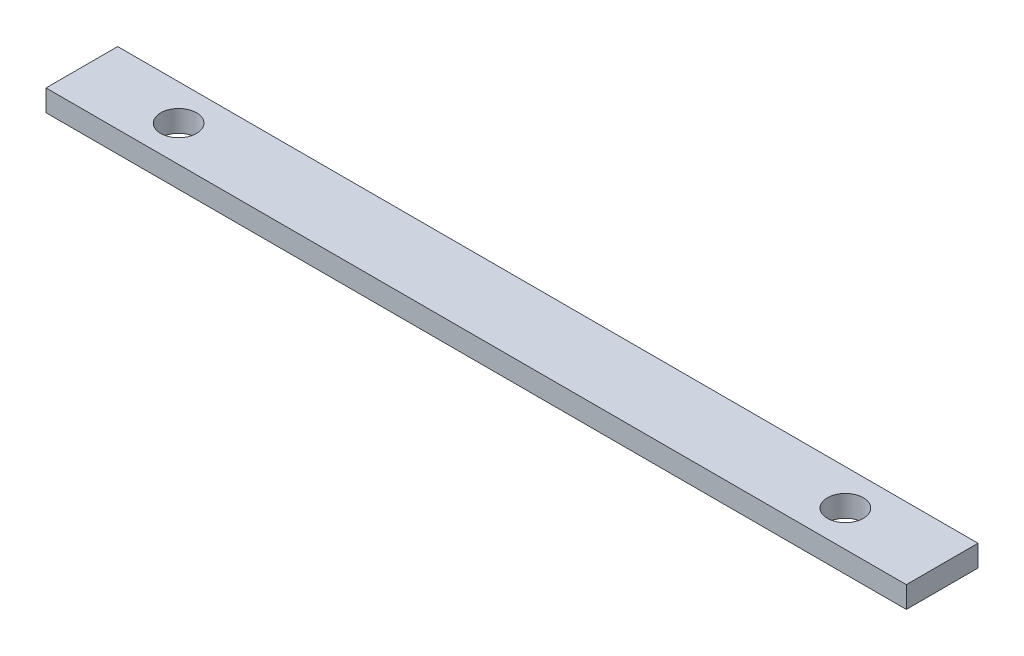
ISO-10303-21;
HEADER;
FILE_DESCRIPTION(('STEP AP214'),'2;1');
FILE_NAME('part.step','',(''),(''),'','','');
FILE_SCHEMA(('AUTOMOTIVE_DESIGN { 1 0 10303 214 1 1 1 1 }'));
ENDSEC;
DATA;
#1=APPLICATION_CONTEXT('core data for automotive mechanical design processes');
#2=APPLICATION_PROTOCOL_DEFINITION('international standard','automotive_design',2000,#1);
#3=PRODUCT_CONTEXT('',#1,'mechanical');
#4=PRODUCT('Part','Part','',(#3));
#5=PRODUCT_RELATED_PRODUCT_CATEGORY('part','',(#4));
#6=PRODUCT_DEFINITION_FORMATION('','',#4);
#7=PRODUCT_DEFINITION_CONTEXT('part definition',#1,'design');
#8=PRODUCT_DEFINITION('design','',#6,#7);
#9=PRODUCT_DEFINITION_SHAPE('','',#8);
#10=(LENGTH_UNIT() NAMED_UNIT(*) SI_UNIT(.MILLI.,.METRE.));
#11=(NAMED_UNIT(*) PLANE_ANGLE_UNIT() SI_UNIT($,.RADIAN.));
#12=(NAMED_UNIT(*) SI_UNIT($,.STERADIAN.) SOLID_ANGLE_UNIT());
#13=UNCERTAINTY_MEASURE_WITH_UNIT(LENGTH_MEASURE(1.E-05),#10,'distance_accuracy_value','');
#14=(GEOMETRIC_REPRESENTATION_CONTEXT(3) GLOBAL_UNCERTAINTY_ASSIGNED_CONTEXT((#13)) GLOBAL_UNIT_ASSIGNED_CONTEXT((#10,
#11,#12)) REPRESENTATION_CONTEXT('',''));
#15=CARTESIAN_POINT('',(0.,0.,0.));
#16=DIRECTION('',(0.,0.,1.));
#17=DIRECTION('',(1.,0.,0.));
#18=AXIS2_PLACEMENT_3D('',#15,#16,#17);
#19=CARTESIAN_POINT('',(60.,3.,5.));
#20=DIRECTION('',(-1.,0.,0.));
#21=DIRECTION('',(0.,0.,1.));
#22=AXIS2_PLACEMENT_3D('',#19,#20,#21);
#23=PLANE('',#22);
#24=DIRECTION('',(0.,0.,-1.));
#25=VECTOR('',#24,1.);
#26=CARTESIAN_POINT('',(60.,0.,5.));
#27=LINE('',#26,#25);
#28=CARTESIAN_POINT('',(60.,0.,5.));
#29=VERTEX_POINT('',#28);
#30=CARTESIAN_POINT('',(60.,0.,-5.));
#31=VERTEX_POINT('',#30);
#32=EDGE_CURVE('E113',#29,#31,#27,.T.);
#33=ORIENTED_EDGE('',*,*,#32,.T.);
#34=DIRECTION('',(0.,-1.,0.));
#35=VECTOR('',#34,1.);
#36=CARTESIAN_POINT('',(60.,3.,-5.));
#37=LINE('',#36,#35);
#38=CARTESIAN_POINT('',(60.,3.,-5.));
#39=VERTEX_POINT('',#38);
#40=EDGE_CURVE('E11',#39,#31,#37,.T.);
#41=ORIENTED_EDGE('',*,*,#40,.F.);
#42=DIRECTION('',(0.,0.,-1.));
#43=VECTOR('',#42,1.);
#44=CARTESIAN_POINT('',(60.,3.,5.));
#45=LINE('',#44,#43);
#46=CARTESIAN_POINT('',(60.,3.,5.));
#47=VERTEX_POINT('',#46);
#48=EDGE_CURVE('E97',#47,#39,#45,.T.);
#49=ORIENTED_EDGE('',*,*,#48,.F.);
#50=DIRECTION('',(0.,-1.,0.));
#51=VECTOR('',#50,1.);
#52=CARTESIAN_POINT('',(60.,3.,5.));
#53=LINE('',#52,#51);
#54=EDGE_CURVE('E109',#47,#29,#53,.T.);
#55=ORIENTED_EDGE('',*,*,#54,.T.);
#56=EDGE_LOOP('',(#33,#41,#49,#55));
#57=FACE_BOUND('',#56,.T.);
#58=ADVANCED_FACE('F45',(#57),#23,.F.);
#59=CARTESIAN_POINT('',(-60.,3.,-5.));
#60=DIRECTION('',(0.,0.,1.));
#61=DIRECTION('',(1.,0.,0.));
#62=AXIS2_PLACEMENT_3D('',#59,#60,#61);
#63=PLANE('',#62);
#64=DIRECTION('',(-1.,0.,0.));
#65=VECTOR('',#64,1.);
#66=CARTESIAN_POINT('',(-60.,0.,-5.));
#67=LINE('',#66,#65);
#68=CARTESIAN_POINT('',(-60.,0.,-5.));
#69=VERTEX_POINT('',#68);
#70=EDGE_CURVE('E102',#31,#69,#67,.T.);
#71=ORIENTED_EDGE('',*,*,#70,.T.);
#72=DIRECTION('',(0.,-1.,0.));
#73=VECTOR('',#72,1.);
#74=CARTESIAN_POINT('',(-60.,3.,-5.));
#75=LINE('',#74,#73);
#76=CARTESIAN_POINT('',(-60.,3.,-5.));
#77=VERTEX_POINT('',#76);
#78=EDGE_CURVE('E54',#77,#69,#75,.T.);
#79=ORIENTED_EDGE('',*,*,#78,.F.);
#80=DIRECTION('',(-1.,0.,0.));
#81=VECTOR('',#80,1.);
#82=CARTESIAN_POINT('',(-60.,3.,-5.));
#83=LINE('',#82,#81);
#84=EDGE_CURVE('E92',#39,#77,#83,.T.);
#85=ORIENTED_EDGE('',*,*,#84,.F.);
#86=ORIENTED_EDGE('',*,*,#40,.T.);
#87=EDGE_LOOP('',(#71,#79,#85,#86));
#88=FACE_BOUND('',#87,.T.);
#89=ADVANCED_FACE('F101',(#88),#63,.F.);
#90=CARTESIAN_POINT('',(-60.,3.,5.));
#91=DIRECTION('',(1.,0.,0.));
#92=DIRECTION('',(0.,0.,-1.));
#93=AXIS2_PLACEMENT_3D('',#90,#91,#92);
#94=PLANE('',#93);
#95=DIRECTION('',(0.,0.,1.));
#96=VECTOR('',#95,1.);
#97=CARTESIAN_POINT('',(-60.,0.,5.));
#98=LINE('',#97,#96);
#99=CARTESIAN_POINT('',(-60.,0.,5.));
#100=VERTEX_POINT('',#99);
#101=EDGE_CURVE('E79',#69,#100,#98,.T.);
#102=ORIENTED_EDGE('',*,*,#101,.T.);
#103=DIRECTION('',(0.,-1.,0.));
#104=VECTOR('',#103,1.);
#105=CARTESIAN_POINT('',(-60.,3.,5.));
#106=LINE('',#105,#104);
#107=CARTESIAN_POINT('',(-60.,3.,5.));
#108=VERTEX_POINT('',#107);
#109=EDGE_CURVE('E104',#108,#100,#106,.T.);
#110=ORIENTED_EDGE('',*,*,#109,.F.);
#111=DIRECTION('',(0.,0.,1.));
#112=VECTOR('',#111,1.);
#113=CARTESIAN_POINT('',(-60.,3.,5.));
#114=LINE('',#113,#112);
#115=EDGE_CURVE('E95',#77,#108,#114,.T.);
#116=ORIENTED_EDGE('',*,*,#115,.F.);
#117=ORIENTED_EDGE('',*,*,#78,.T.);
#118=EDGE_LOOP('',(#102,#110,#116,#117));
#119=FACE_BOUND('',#118,.T.);
#120=ADVANCED_FACE('F105',(#119),#94,.F.);
#121=CARTESIAN_POINT('',(-60.,3.,5.));
#122=DIRECTION('',(0.,0.,-1.));
#123=DIRECTION('',(-1.,0.,0.));
#124=AXIS2_PLACEMENT_3D('',#121,#122,#123);
#125=PLANE('',#124);
#126=DIRECTION('',(1.,0.,0.));
#127=VECTOR('',#126,1.);
#128=CARTESIAN_POINT('',(-60.,0.,5.));
#129=LINE('',#128,#127);
#130=EDGE_CURVE('E85',#100,#29,#129,.T.);
#131=ORIENTED_EDGE('',*,*,#130,.T.);
#132=ORIENTED_EDGE('',*,*,#54,.F.);
#133=DIRECTION('',(1.,0.,0.));
#134=VECTOR('',#133,1.);
#135=CARTESIAN_POINT('',(-60.,3.,5.));
#136=LINE('',#135,#134);
#137=EDGE_CURVE('E62',#108,#47,#136,.T.);
#138=ORIENTED_EDGE('',*,*,#137,.F.);
#139=ORIENTED_EDGE('',*,*,#109,.T.);
#140=EDGE_LOOP('',(#131,#132,#138,#139));
#141=FACE_BOUND('',#140,.T.);
#142=ADVANCED_FACE('F127',(#141),#125,.F.);
#143=CARTESIAN_POINT('',(0.,3.,0.));
#144=DIRECTION('',(0.,-1.,0.));
#145=DIRECTION('',(0.,0.,-1.));
#146=AXIS2_PLACEMENT_3D('',#143,#144,#145);
#147=PLANE('',#146);
#148=CARTESIAN_POINT('',(-46.5,3.,0.));
#149=DIRECTION('',(0.,-1.,0.));
#150=DIRECTION('',(0.,0.,-1.));
#151=AXIS2_PLACEMENT_3D('',#148,#149,#150);
#152=CIRCLE('',#151,2.5);
#153=CARTESIAN_POINT('',(-46.5,3.,-2.5));
#154=VERTEX_POINT('',#153);
#155=EDGE_CURVE('E117',#154,#154,#152,.T.);
#156=ORIENTED_EDGE('',*,*,#155,.T.);
#157=EDGE_LOOP('',(#156));
#158=FACE_BOUND('',#157,.T.);
#159=CARTESIAN_POINT('',(46.5,3.,0.));
#160=DIRECTION('',(0.,-1.,0.));
#161=DIRECTION('',(0.,0.,-1.));
#162=AXIS2_PLACEMENT_3D('',#159,#160,#161);
#163=CIRCLE('',#162,2.50000000000001);
#164=CARTESIAN_POINT('',(46.5,3.,-2.50000000000002));
#165=VERTEX_POINT('',#164);
#166=EDGE_CURVE('E139',#165,#165,#163,.T.);
#167=ORIENTED_EDGE('',*,*,#166,.T.);
#168=EDGE_LOOP('',(#167));
#169=FACE_BOUND('',#168,.T.);
#170=ORIENTED_EDGE('',*,*,#48,.T.);
#171=ORIENTED_EDGE('',*,*,#84,.T.);
#172=ORIENTED_EDGE('',*,*,#115,.T.);
#173=ORIENTED_EDGE('',*,*,#137,.T.);
#174=EDGE_LOOP('',(#170,#171,#172,#173));
#175=FACE_BOUND('',#174,.T.);
#176=ADVANCED_FACE('F93',(#158,#169,#175),#147,.F.);
#177=CARTESIAN_POINT('',(0.,0.,0.));
#178=DIRECTION('',(0.,-1.,0.));
#179=DIRECTION('',(0.,0.,-1.));
#180=AXIS2_PLACEMENT_3D('',#177,#178,#179);
#181=PLANE('',#180);
#182=CARTESIAN_POINT('',(-46.5,0.,0.));
#183=DIRECTION('',(0.,1.,0.));
#184=DIRECTION('',(0.,0.,1.));
#185=AXIS2_PLACEMENT_3D('',#182,#183,#184);
#186=CIRCLE('',#185,2.5);
#187=CARTESIAN_POINT('',(-46.5,0.,-2.5));
#188=VERTEX_POINT('',#187);
#189=EDGE_CURVE('E138',#188,#188,#186,.T.);
#190=ORIENTED_EDGE('',*,*,#189,.T.);
#191=EDGE_LOOP('',(#190));
#192=FACE_BOUND('',#191,.T.);
#193=CARTESIAN_POINT('',(46.5,0.,0.));
#194=DIRECTION('',(0.,1.,0.));
#195=DIRECTION('',(0.,0.,-1.));
#196=AXIS2_PLACEMENT_3D('',#193,#194,#195);
#197=CIRCLE('',#196,2.50000000000001);
#198=CARTESIAN_POINT('',(46.5,0.,-2.50000000000002));
#199=VERTEX_POINT('',#198);
#200=EDGE_CURVE('E134',#199,#199,#197,.T.);
#201=ORIENTED_EDGE('',*,*,#200,.T.);
#202=EDGE_LOOP('',(#201));
#203=FACE_BOUND('',#202,.T.);
#204=ORIENTED_EDGE('',*,*,#32,.F.);
#205=ORIENTED_EDGE('',*,*,#130,.F.);
#206=ORIENTED_EDGE('',*,*,#101,.F.);
#207=ORIENTED_EDGE('',*,*,#70,.F.);
#208=EDGE_LOOP('',(#204,#205,#206,#207));
#209=FACE_BOUND('',#208,.T.);
#210=ADVANCED_FACE('F130',(#192,#203,#209),#181,.T.);
#211=CARTESIAN_POINT('',(46.5,10.0710678118655,0.));
#212=DIRECTION('',(0.,-1.,0.));
#213=DIRECTION('',(0.,0.,-1.));
#214=AXIS2_PLACEMENT_3D('',#211,#212,#213);
#215=CYLINDRICAL_SURFACE('',#214,2.50000000000001);
#216=CARTESIAN_POINT('',(46.5,3.,-2.50000000000002));
#217=CARTESIAN_POINT('',(46.5,2.96875,-2.50000000000002));
#218=CARTESIAN_POINT('',(46.5,2.9375,-2.50000000000002));
#219=CARTESIAN_POINT('',(46.5,2.875,-2.50000000000002));
#220=CARTESIAN_POINT('',(46.5,2.84375,-2.50000000000002));
#221=CARTESIAN_POINT('',(46.5,2.78125,-2.50000000000002));
#222=CARTESIAN_POINT('',(46.5,2.75,-2.50000000000002));
#223=CARTESIAN_POINT('',(46.5,2.6875,-2.50000000000002));
#224=CARTESIAN_POINT('',(46.5,2.65625,-2.50000000000002));
#225=CARTESIAN_POINT('',(46.5,2.59375,-2.50000000000002));
#226=CARTESIAN_POINT('',(46.5,2.5625,-2.50000000000002));
#227=CARTESIAN_POINT('',(46.5,2.5,-2.50000000000002));
#228=CARTESIAN_POINT('',(46.5,2.46875,-2.50000000000002));
#229=CARTESIAN_POINT('',(46.5,2.40625,-2.50000000000002));
#230=CARTESIAN_POINT('',(46.5,2.375,-2.50000000000002));
#231=CARTESIAN_POINT('',(46.5,2.3125,-2.50000000000002));
#232=CARTESIAN_POINT('',(46.5,2.28125,-2.50000000000002));
#233=CARTESIAN_POINT('',(46.5,2.21875,-2.50000000000002));
#234=CARTESIAN_POINT('',(46.5,2.1875,-2.50000000000002));
#235=CARTESIAN_POINT('',(46.5,2.125,-2.50000000000002));
#236=CARTESIAN_POINT('',(46.5,2.09375,-2.50000000000002));
#237=CARTESIAN_POINT('',(46.5,2.03125,-2.50000000000002));
#238=CARTESIAN_POINT('',(46.5,2.,-2.50000000000002));
#239=CARTESIAN_POINT('',(46.5,1.9375,-2.50000000000002));
#240=CARTESIAN_POINT('',(46.5,1.90625,-2.50000000000002));
#241=CARTESIAN_POINT('',(46.5,1.84375,-2.50000000000002));
#242=CARTESIAN_POINT('',(46.5,1.8125,-2.50000000000002));
#243=CARTESIAN_POINT('',(46.5,1.75,-2.50000000000002));
#244=CARTESIAN_POINT('',(46.5,1.71875,-2.50000000000002));
#245=CARTESIAN_POINT('',(46.5,1.65625,-2.50000000000002));
#246=CARTESIAN_POINT('',(46.5,1.625,-2.50000000000002));
#247=CARTESIAN_POINT('',(46.5,1.5625,-2.50000000000002));
#248=CARTESIAN_POINT('',(46.5,1.53125,-2.50000000000002));
#249=CARTESIAN_POINT('',(46.5,1.46875,-2.50000000000002));
#250=CARTESIAN_POINT('',(46.5,1.4375,-2.50000000000002));
#251=CARTESIAN_POINT('',(46.5,1.375,-2.50000000000002));
#252=CARTESIAN_POINT('',(46.5,1.34375,-2.50000000000002));
#253=CARTESIAN_POINT('',(46.5,1.28125,-2.50000000000002));
#254=CARTESIAN_POINT('',(46.5,1.25,-2.50000000000002));
#255=CARTESIAN_POINT('',(46.5,1.1875,-2.50000000000002));
#256=CARTESIAN_POINT('',(46.5,1.15625,-2.50000000000002));
#257=CARTESIAN_POINT('',(46.5,1.09375,-2.50000000000002));
#258=CARTESIAN_POINT('',(46.5,1.0625,-2.50000000000002));
#259=CARTESIAN_POINT('',(46.5,0.999999999999999,-2.50000000000002));
#260=CARTESIAN_POINT('',(46.5,0.968749999999999,-2.50000000000002));
#261=CARTESIAN_POINT('',(46.5,0.906249999999999,-2.50000000000002));
#262=CARTESIAN_POINT('',(46.5,0.874999999999999,-2.50000000000002));
#263=CARTESIAN_POINT('',(46.5,0.812499999999999,-2.50000000000002));
#264=CARTESIAN_POINT('',(46.5,0.781249999999999,-2.50000000000002));
#265=CARTESIAN_POINT('',(46.5,0.718749999999999,-2.50000000000002));
#266=CARTESIAN_POINT('',(46.5,0.687499999999999,-2.50000000000002));
#267=CARTESIAN_POINT('',(46.5,0.624999999999999,-2.50000000000002));
#268=CARTESIAN_POINT('',(46.5,0.593749999999999,-2.50000000000002));
#269=CARTESIAN_POINT('',(46.5,0.531249999999999,-2.50000000000002));
#270=CARTESIAN_POINT('',(46.5,0.499999999999999,-2.50000000000002));
#271=CARTESIAN_POINT('',(46.5,0.437499999999999,-2.50000000000002));
#272=CARTESIAN_POINT('',(46.5,0.406249999999999,-2.50000000000002));
#273=CARTESIAN_POINT('',(46.5,0.343749999999999,-2.50000000000002));
#274=CARTESIAN_POINT('',(46.5,0.312499999999999,-2.50000000000002));
#275=CARTESIAN_POINT('',(46.5,0.249999999999999,-2.50000000000002));
#276=CARTESIAN_POINT('',(46.5,0.218749999999998,-2.50000000000002));
#277=CARTESIAN_POINT('',(46.5,0.156249999999998,-2.50000000000002));
#278=CARTESIAN_POINT('',(46.5,0.124999999999998,-2.50000000000002));
#279=CARTESIAN_POINT('',(46.5,0.0624999999999983,-2.50000000000002));
#280=CARTESIAN_POINT('',(46.5,0.0312499999999983,-2.50000000000002));
#281=CARTESIAN_POINT('',(46.5,0.,-2.50000000000002));
#282=B_SPLINE_CURVE_WITH_KNOTS('',3,(#216,#217,#218,#219,#220,#221,#222,#223,#224,#225,#226,
#227,#228,#229,#230,#231,#232,#233,#234,#235,#236,#237,#238,#239,#240,#241,#242,#243,#244,#245,
#246,#247,#248,#249,#250,#251,#252,#253,#254,#255,#256,#257,#258,#259,#260,#261,#262,#263,#264,
#265,#266,#267,#268,#269,#270,#271,#272,#273,#274,#275,#276,#277,#278,#279,#280,#281),
.UNSPECIFIED.,.F.,.F.,(4,2,2,2,2,2,2,2,2,2,2,2,2,2,2,2,2,2,2,2,2,2,2,2,2,2,2,2,2,2,2,2,4),(0.,
0.0937500000000001,0.1875,0.28125,0.375,0.46875,0.5625,0.656250000000001,0.75,0.84375,0.9375,
1.03125,1.125,1.21875,1.3125,1.40625,1.5,1.59375,1.6875,1.78125,1.875,1.96875,2.0625,2.15625,
2.25,2.34375,2.4375,2.53125,2.625,2.71875,2.8125,2.90625,3.),.UNSPECIFIED.);
#283=EDGE_CURVE('BSEAM154',#165,#199,#282,.T.);
#284=ORIENTED_EDGE('',*,*,#166,.F.);
#285=ORIENTED_EDGE('',*,*,#200,.F.);
#286=ORIENTED_EDGE('',*,*,#283,.T.);
#287=ORIENTED_EDGE('',*,*,#283,.F.);
#288=EDGE_LOOP('',(#284,#286,#285,#287));
#289=FACE_BOUND('',#288,.T.);
#290=ADVANCED_FACE('F154',(#289),#215,.F.);
#291=CARTESIAN_POINT('',(-46.5,10.0710678118655,0.));
#292=DIRECTION('',(0.,-1.,0.));
#293=DIRECTION('',(0.,0.,-1.));
#294=AXIS2_PLACEMENT_3D('',#291,#292,#293);
#295=CYLINDRICAL_SURFACE('',#294,2.5);
#296=CARTESIAN_POINT('',(-46.5,3.,-2.5));
#297=CARTESIAN_POINT('',(-46.5,2.96875,-2.5));
#298=CARTESIAN_POINT('',(-46.5,2.9375,-2.5));
#299=CARTESIAN_POINT('',(-46.5,2.875,-2.5));
#300=CARTESIAN_POINT('',(-46.5,2.84375,-2.5));
#301=CARTESIAN_POINT('',(-46.5,2.78125,-2.5));
#302=CARTESIAN_POINT('',(-46.5,2.75,-2.5));
#303=CARTESIAN_POINT('',(-46.5,2.6875,-2.5));
#304=CARTESIAN_POINT('',(-46.5,2.65625,-2.5));
#305=CARTESIAN_POINT('',(-46.5,2.59375,-2.5));
#306=CARTESIAN_POINT('',(-46.5,2.5625,-2.5));
#307=CARTESIAN_POINT('',(-46.5,2.5,-2.5));
#308=CARTESIAN_POINT('',(-46.5,2.46875,-2.5));
#309=CARTESIAN_POINT('',(-46.5,2.40625,-2.5));
#310=CARTESIAN_POINT('',(-46.5,2.375,-2.5));
#311=CARTESIAN_POINT('',(-46.5,2.3125,-2.5));
#312=CARTESIAN_POINT('',(-46.5,2.28125,-2.5));
#313=CARTESIAN_POINT('',(-46.5,2.21875,-2.5));
#314=CARTESIAN_POINT('',(-46.5,2.1875,-2.5));
#315=CARTESIAN_POINT('',(-46.5,2.125,-2.5));
#316=CARTESIAN_POINT('',(-46.5,2.09375,-2.5));
#317=CARTESIAN_POINT('',(-46.5,2.03125,-2.5));
#318=CARTESIAN_POINT('',(-46.5,2.,-2.5));
#319=CARTESIAN_POINT('',(-46.5,1.9375,-2.5));
#320=CARTESIAN_POINT('',(-46.5,1.90625,-2.5));
#321=CARTESIAN_POINT('',(-46.5,1.84375,-2.5));
#322=CARTESIAN_POINT('',(-46.5,1.8125,-2.5));
#323=CARTESIAN_POINT('',(-46.5,1.75,-2.5));
#324=CARTESIAN_POINT('',(-46.5,1.71875,-2.5));
#325=CARTESIAN_POINT('',(-46.5,1.65625,-2.5));
#326=CARTESIAN_POINT('',(-46.5,1.625,-2.5));
#327=CARTESIAN_POINT('',(-46.5,1.5625,-2.5));
#328=CARTESIAN_POINT('',(-46.5,1.53125,-2.5));
#329=CARTESIAN_POINT('',(-46.5,1.46875,-2.5));
#330=CARTESIAN_POINT('',(-46.5,1.4375,-2.5));
#331=CARTESIAN_POINT('',(-46.5,1.375,-2.5));
#332=CARTESIAN_POINT('',(-46.5,1.34375,-2.5));
#333=CARTESIAN_POINT('',(-46.5,1.28125,-2.5));
#334=CARTESIAN_POINT('',(-46.5,1.25,-2.5));
#335=CARTESIAN_POINT('',(-46.5,1.1875,-2.5));
#336=CARTESIAN_POINT('',(-46.5,1.15625,-2.5));
#337=CARTESIAN_POINT('',(-46.5,1.09375,-2.5));
#338=CARTESIAN_POINT('',(-46.5,1.0625,-2.5));
#339=CARTESIAN_POINT('',(-46.5,0.999999999999999,-2.5));
#340=CARTESIAN_POINT('',(-46.5,0.968749999999999,-2.5));
#341=CARTESIAN_POINT('',(-46.5,0.906249999999999,-2.5));
#342=CARTESIAN_POINT('',(-46.5,0.874999999999999,-2.5));
#343=CARTESIAN_POINT('',(-46.5,0.812499999999999,-2.5));
#344=CARTESIAN_POINT('',(-46.5,0.781249999999999,-2.5));
#345=CARTESIAN_POINT('',(-46.5,0.718749999999999,-2.5));
#346=CARTESIAN_POINT('',(-46.5,0.687499999999999,-2.5));
#347=CARTESIAN_POINT('',(-46.5,0.624999999999999,-2.5));
#348=CARTESIAN_POINT('',(-46.5,0.593749999999999,-2.5));
#349=CARTESIAN_POINT('',(-46.5,0.531249999999999,-2.5));
#350=CARTESIAN_POINT('',(-46.5,0.499999999999999,-2.5));
#351=CARTESIAN_POINT('',(-46.5,0.437499999999999,-2.5));
#352=CARTESIAN_POINT('',(-46.5,0.406249999999999,-2.5));
#353=CARTESIAN_POINT('',(-46.5,0.343749999999999,-2.5));
#354=CARTESIAN_POINT('',(-46.5,0.312499999999999,-2.5));
#355=CARTESIAN_POINT('',(-46.5,0.249999999999999,-2.5));
#356=CARTESIAN_POINT('',(-46.5,0.218749999999998,-2.5));
#357=CARTESIAN_POINT('',(-46.5,0.156249999999998,-2.5));
#358=CARTESIAN_POINT('',(-46.5,0.124999999999998,-2.5));
#359=CARTESIAN_POINT('',(-46.5,0.0624999999999983,-2.5));
#360=CARTESIAN_POINT('',(-46.5,0.0312499999999983,-2.5));
#361=CARTESIAN_POINT('',(-46.5,0.,-2.5));
#362=B_SPLINE_CURVE_WITH_KNOTS('',3,(#296,#297,#298,#299,#300,#301,#302,#303,#304,#305,#306,
#307,#308,#309,#310,#311,#312,#313,#314,#315,#316,#317,#318,#319,#320,#321,#322,#323,#324,#325,
#326,#327,#328,#329,#330,#331,#332,#333,#334,#335,#336,#337,#338,#339,#340,#341,#342,#343,#344,
#345,#346,#347,#348,#349,#350,#351,#352,#353,#354,#355,#356,#357,#358,#359,#360,#361),
.UNSPECIFIED.,.F.,.F.,(4,2,2,2,2,2,2,2,2,2,2,2,2,2,2,2,2,2,2,2,2,2,2,2,2,2,2,2,2,2,2,2,4),(0.,
0.0937500000000001,0.1875,0.28125,0.375,0.46875,0.5625,0.656250000000001,0.75,0.84375,0.9375,
1.03125,1.125,1.21875,1.3125,1.40625,1.5,1.59375,1.6875,1.78125,1.875,1.96875,2.0625,2.15625,
2.25,2.34375,2.4375,2.53125,2.625,2.71875,2.8125,2.90625,3.),.UNSPECIFIED.);
#363=EDGE_CURVE('BSEAM152',#154,#188,#362,.T.);
#364=ORIENTED_EDGE('',*,*,#155,.F.);
#365=ORIENTED_EDGE('',*,*,#189,.F.);
#366=ORIENTED_EDGE('',*,*,#363,.T.);
#367=ORIENTED_EDGE('',*,*,#363,.F.);
#368=EDGE_LOOP('',(#364,#366,#365,#367));
#369=FACE_BOUND('',#368,.T.);
#370=ADVANCED_FACE('F152',(#369),#295,.F.);
#371=CLOSED_SHELL('',(#58,#89,#120,#142,#176,#210,#290,#370));
#372=MANIFOLD_SOLID_BREP('B2',#371);
#373=ADVANCED_BREP_SHAPE_REPRESENTATION('',(#18,#372),#14);
#374=SHAPE_DEFINITION_REPRESENTATION(#9,#373);
ENDSEC;
END-ISO-10303-21;
